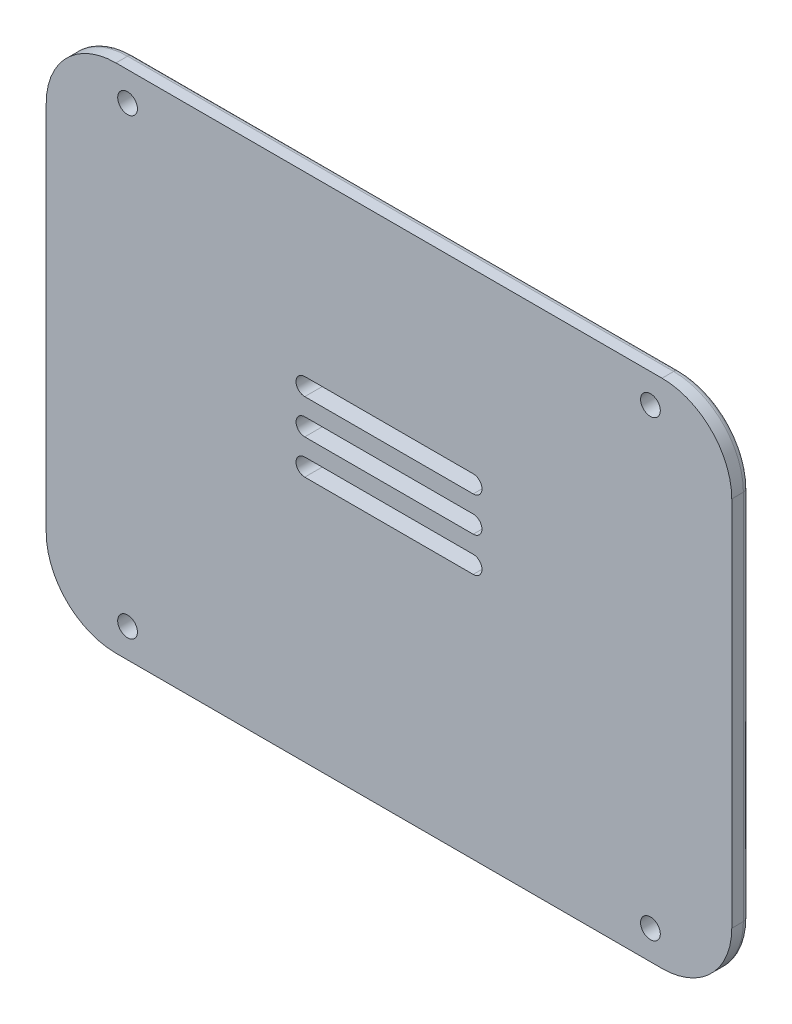
ISO-10303-21;
HEADER;
FILE_DESCRIPTION(('STEP AP214'),'2;1');
FILE_NAME('part.step','',(''),(''),'','','');
FILE_SCHEMA(('AUTOMOTIVE_DESIGN { 1 0 10303 214 1 1 1 1 }'));
ENDSEC;
DATA;
#1=APPLICATION_CONTEXT('core data for automotive mechanical design processes');
#2=APPLICATION_PROTOCOL_DEFINITION('international standard','automotive_design',2000,#1);
#3=PRODUCT_CONTEXT('',#1,'mechanical');
#4=PRODUCT('Part','Part','',(#3));
#5=PRODUCT_RELATED_PRODUCT_CATEGORY('part','',(#4));
#6=PRODUCT_DEFINITION_FORMATION('','',#4);
#7=PRODUCT_DEFINITION_CONTEXT('part definition',#1,'design');
#8=PRODUCT_DEFINITION('design','',#6,#7);
#9=PRODUCT_DEFINITION_SHAPE('','',#8);
#10=(LENGTH_UNIT() NAMED_UNIT(*) SI_UNIT(.MILLI.,.METRE.));
#11=(NAMED_UNIT(*) PLANE_ANGLE_UNIT() SI_UNIT($,.RADIAN.));
#12=(NAMED_UNIT(*) SI_UNIT($,.STERADIAN.) SOLID_ANGLE_UNIT());
#13=UNCERTAINTY_MEASURE_WITH_UNIT(LENGTH_MEASURE(1.E-05),#10,'distance_accuracy_value','');
#14=(GEOMETRIC_REPRESENTATION_CONTEXT(3) GLOBAL_UNCERTAINTY_ASSIGNED_CONTEXT((#13)) GLOBAL_UNIT_ASSIGNED_CONTEXT((#10,
#11,#12)) REPRESENTATION_CONTEXT('',''));
#15=CARTESIAN_POINT('',(0.,0.,0.));
#16=DIRECTION('',(0.,0.,1.));
#17=DIRECTION('',(1.,0.,0.));
#18=AXIS2_PLACEMENT_3D('',#15,#16,#17);
#19=CARTESIAN_POINT('',(47.,32.,3.));
#20=DIRECTION('',(0.,0.,-1.));
#21=DIRECTION('',(-1.,0.,0.));
#22=AXIS2_PLACEMENT_3D('',#19,#20,#21);
#23=CYLINDRICAL_SURFACE('',#22,12.);
#24=DIRECTION('',(0.,0.,-1.));
#25=VECTOR('',#24,1.);
#26=CARTESIAN_POINT('',(59.,31.9999999999999,3.));
#27=LINE('',#26,#25);
#28=CARTESIAN_POINT('',(59.,31.9999999999999,3.));
#29=VERTEX_POINT('',#28);
#30=CARTESIAN_POINT('',(59.,31.9999999999999,1.));
#31=VERTEX_POINT('',#30);
#32=EDGE_CURVE('E345',#29,#31,#27,.T.);
#33=ORIENTED_EDGE('',*,*,#32,.T.);
#34=CARTESIAN_POINT('',(47.,32.,1.));
#35=DIRECTION('',(0.,0.,-1.));
#36=DIRECTION('',(-1.,0.,0.));
#37=AXIS2_PLACEMENT_3D('',#34,#35,#36);
#38=CIRCLE('',#37,12.);
#39=CARTESIAN_POINT('',(46.9999999999999,44.,1.));
#40=VERTEX_POINT('',#39);
#41=EDGE_CURVE('E11',#31,#40,#38,.F.);
#42=ORIENTED_EDGE('',*,*,#41,.T.);
#43=DIRECTION('',(0.,0.,-1.));
#44=VECTOR('',#43,1.);
#45=CARTESIAN_POINT('',(46.9999999999999,44.,3.));
#46=LINE('',#45,#44);
#47=CARTESIAN_POINT('',(46.9999999999999,44.,3.));
#48=VERTEX_POINT('',#47);
#49=EDGE_CURVE('E366',#48,#40,#46,.T.);
#50=ORIENTED_EDGE('',*,*,#49,.F.);
#51=CARTESIAN_POINT('',(47.,32.,3.));
#52=DIRECTION('',(0.,0.,1.));
#53=DIRECTION('',(-1.,0.,0.));
#54=AXIS2_PLACEMENT_3D('',#51,#52,#53);
#55=CIRCLE('',#54,12.);
#56=EDGE_CURVE('E328',#29,#48,#55,.T.);
#57=ORIENTED_EDGE('',*,*,#56,.F.);
#58=EDGE_LOOP('',(#33,#42,#50,#57));
#59=FACE_BOUND('',#58,.T.);
#60=ADVANCED_FACE('F39',(#59),#23,.T.);
#61=CARTESIAN_POINT('',(-46.9999999999999,44.,3.));
#62=DIRECTION('',(0.,-1.,0.));
#63=DIRECTION('',(0.,0.,-1.));
#64=AXIS2_PLACEMENT_3D('',#61,#62,#63);
#65=PLANE('',#64);
#66=ORIENTED_EDGE('',*,*,#49,.T.);
#67=DIRECTION('',(-1.,0.,0.));
#68=VECTOR('',#67,1.);
#69=CARTESIAN_POINT('',(-46.9999999999999,44.,1.));
#70=LINE('',#69,#68);
#71=CARTESIAN_POINT('',(-46.9999999999999,44.,1.));
#72=VERTEX_POINT('',#71);
#73=EDGE_CURVE('E393',#40,#72,#70,.T.);
#74=ORIENTED_EDGE('',*,*,#73,.T.);
#75=DIRECTION('',(0.,0.,-1.));
#76=VECTOR('',#75,1.);
#77=CARTESIAN_POINT('',(-46.9999999999999,44.,3.));
#78=LINE('',#77,#76);
#79=CARTESIAN_POINT('',(-46.9999999999999,44.,3.));
#80=VERTEX_POINT('',#79);
#81=EDGE_CURVE('E363',#80,#72,#78,.T.);
#82=ORIENTED_EDGE('',*,*,#81,.F.);
#83=DIRECTION('',(-1.,0.,0.));
#84=VECTOR('',#83,1.);
#85=CARTESIAN_POINT('',(-46.9999999999999,44.,3.));
#86=LINE('',#85,#84);
#87=EDGE_CURVE('E331',#48,#80,#86,.T.);
#88=ORIENTED_EDGE('',*,*,#87,.F.);
#89=EDGE_LOOP('',(#66,#74,#82,#88));
#90=FACE_BOUND('',#89,.T.);
#91=ADVANCED_FACE('F488',(#90),#65,.F.);
#92=CARTESIAN_POINT('',(-47.,32.,3.));
#93=DIRECTION('',(0.,0.,-1.));
#94=DIRECTION('',(-1.,0.,0.));
#95=AXIS2_PLACEMENT_3D('',#92,#93,#94);
#96=CYLINDRICAL_SURFACE('',#95,12.);
#97=ORIENTED_EDGE('',*,*,#81,.T.);
#98=CARTESIAN_POINT('',(-47.,32.,1.));
#99=DIRECTION('',(0.,0.,-1.));
#100=DIRECTION('',(-1.,0.,0.));
#101=AXIS2_PLACEMENT_3D('',#98,#99,#100);
#102=CIRCLE('',#101,12.);
#103=CARTESIAN_POINT('',(-59.,31.9999999999999,1.));
#104=VERTEX_POINT('',#103);
#105=EDGE_CURVE('E395',#72,#104,#102,.F.);
#106=ORIENTED_EDGE('',*,*,#105,.T.);
#107=DIRECTION('',(0.,0.,-1.));
#108=VECTOR('',#107,1.);
#109=CARTESIAN_POINT('',(-59.,31.9999999999999,3.));
#110=LINE('',#109,#108);
#111=CARTESIAN_POINT('',(-59.,31.9999999999999,3.));
#112=VERTEX_POINT('',#111);
#113=EDGE_CURVE('E360',#112,#104,#110,.T.);
#114=ORIENTED_EDGE('',*,*,#113,.F.);
#115=CARTESIAN_POINT('',(-47.,32.,3.));
#116=DIRECTION('',(0.,0.,1.));
#117=DIRECTION('',(-1.,0.,0.));
#118=AXIS2_PLACEMENT_3D('',#115,#116,#117);
#119=CIRCLE('',#118,12.);
#120=EDGE_CURVE('E333',#80,#112,#119,.T.);
#121=ORIENTED_EDGE('',*,*,#120,.F.);
#122=EDGE_LOOP('',(#97,#106,#114,#121));
#123=FACE_BOUND('',#122,.T.);
#124=ADVANCED_FACE('F470',(#123),#96,.T.);
#125=CARTESIAN_POINT('',(-59.,-31.9999999999999,3.));
#126=DIRECTION('',(1.,0.,0.));
#127=DIRECTION('',(0.,0.,-1.));
#128=AXIS2_PLACEMENT_3D('',#125,#126,#127);
#129=PLANE('',#128);
#130=ORIENTED_EDGE('',*,*,#113,.T.);
#131=DIRECTION('',(0.,-1.,0.));
#132=VECTOR('',#131,1.);
#133=CARTESIAN_POINT('',(-59.,-31.9999999999999,1.));
#134=LINE('',#133,#132);
#135=CARTESIAN_POINT('',(-59.,-31.9999999999999,1.));
#136=VERTEX_POINT('',#135);
#137=EDGE_CURVE('E391',#104,#136,#134,.T.);
#138=ORIENTED_EDGE('',*,*,#137,.T.);
#139=DIRECTION('',(0.,0.,-1.));
#140=VECTOR('',#139,1.);
#141=CARTESIAN_POINT('',(-59.,-31.9999999999999,3.));
#142=LINE('',#141,#140);
#143=CARTESIAN_POINT('',(-59.,-31.9999999999999,3.));
#144=VERTEX_POINT('',#143);
#145=EDGE_CURVE('E357',#144,#136,#142,.T.);
#146=ORIENTED_EDGE('',*,*,#145,.F.);
#147=DIRECTION('',(0.,-1.,0.));
#148=VECTOR('',#147,1.);
#149=CARTESIAN_POINT('',(-59.,-31.9999999999999,3.));
#150=LINE('',#149,#148);
#151=EDGE_CURVE('E335',#112,#144,#150,.T.);
#152=ORIENTED_EDGE('',*,*,#151,.F.);
#153=EDGE_LOOP('',(#130,#138,#146,#152));
#154=FACE_BOUND('',#153,.T.);
#155=ADVANCED_FACE('F466',(#154),#129,.F.);
#156=CARTESIAN_POINT('',(-47.,-32.,3.));
#157=DIRECTION('',(0.,0.,-1.));
#158=DIRECTION('',(-1.,0.,0.));
#159=AXIS2_PLACEMENT_3D('',#156,#157,#158);
#160=CYLINDRICAL_SURFACE('',#159,12.);
#161=ORIENTED_EDGE('',*,*,#145,.T.);
#162=CARTESIAN_POINT('',(-47.,-32.,1.));
#163=DIRECTION('',(0.,0.,-1.));
#164=DIRECTION('',(-1.,0.,0.));
#165=AXIS2_PLACEMENT_3D('',#162,#163,#164);
#166=CIRCLE('',#165,12.);
#167=CARTESIAN_POINT('',(-46.9999999999999,-44.,1.));
#168=VERTEX_POINT('',#167);
#169=EDGE_CURVE('E397',#136,#168,#166,.F.);
#170=ORIENTED_EDGE('',*,*,#169,.T.);
#171=DIRECTION('',(0.,0.,-1.));
#172=VECTOR('',#171,1.);
#173=CARTESIAN_POINT('',(-46.9999999999999,-44.,3.));
#174=LINE('',#173,#172);
#175=CARTESIAN_POINT('',(-46.9999999999999,-44.,3.));
#176=VERTEX_POINT('',#175);
#177=EDGE_CURVE('E354',#176,#168,#174,.T.);
#178=ORIENTED_EDGE('',*,*,#177,.F.);
#179=CARTESIAN_POINT('',(-47.,-32.,3.));
#180=DIRECTION('',(0.,0.,1.));
#181=DIRECTION('',(-1.,0.,0.));
#182=AXIS2_PLACEMENT_3D('',#179,#180,#181);
#183=CIRCLE('',#182,12.);
#184=EDGE_CURVE('E337',#144,#176,#183,.T.);
#185=ORIENTED_EDGE('',*,*,#184,.F.);
#186=EDGE_LOOP('',(#161,#170,#178,#185));
#187=FACE_BOUND('',#186,.T.);
#188=ADVANCED_FACE('F462',(#187),#160,.T.);
#189=CARTESIAN_POINT('',(-46.9999999999999,-44.,3.));
#190=DIRECTION('',(0.,1.,0.));
#191=DIRECTION('',(0.,0.,1.));
#192=AXIS2_PLACEMENT_3D('',#189,#190,#191);
#193=PLANE('',#192);
#194=ORIENTED_EDGE('',*,*,#177,.T.);
#195=DIRECTION('',(1.,0.,0.));
#196=VECTOR('',#195,1.);
#197=CARTESIAN_POINT('',(46.9999999999999,-44.,1.));
#198=LINE('',#197,#196);
#199=CARTESIAN_POINT('',(46.9999999999999,-44.,1.));
#200=VERTEX_POINT('',#199);
#201=EDGE_CURVE('E389',#168,#200,#198,.T.);
#202=ORIENTED_EDGE('',*,*,#201,.T.);
#203=DIRECTION('',(0.,0.,-1.));
#204=VECTOR('',#203,1.);
#205=CARTESIAN_POINT('',(46.9999999999999,-44.,3.));
#206=LINE('',#205,#204);
#207=CARTESIAN_POINT('',(46.9999999999999,-44.,3.));
#208=VERTEX_POINT('',#207);
#209=EDGE_CURVE('E351',#208,#200,#206,.T.);
#210=ORIENTED_EDGE('',*,*,#209,.F.);
#211=DIRECTION('',(1.,0.,0.));
#212=VECTOR('',#211,1.);
#213=CARTESIAN_POINT('',(-46.9999999999999,-44.,3.));
#214=LINE('',#213,#212);
#215=EDGE_CURVE('E339',#176,#208,#214,.T.);
#216=ORIENTED_EDGE('',*,*,#215,.F.);
#217=EDGE_LOOP('',(#194,#202,#210,#216));
#218=FACE_BOUND('',#217,.T.);
#219=ADVANCED_FACE('F460',(#218),#193,.F.);
#220=CARTESIAN_POINT('',(47.,-32.,3.));
#221=DIRECTION('',(0.,0.,-1.));
#222=DIRECTION('',(-1.,0.,0.));
#223=AXIS2_PLACEMENT_3D('',#220,#221,#222);
#224=CYLINDRICAL_SURFACE('',#223,12.);
#225=ORIENTED_EDGE('',*,*,#209,.T.);
#226=CARTESIAN_POINT('',(47.,-32.,1.));
#227=DIRECTION('',(0.,0.,-1.));
#228=DIRECTION('',(-1.,0.,0.));
#229=AXIS2_PLACEMENT_3D('',#226,#227,#228);
#230=CIRCLE('',#229,12.);
#231=CARTESIAN_POINT('',(59.,-32.,1.));
#232=VERTEX_POINT('',#231);
#233=EDGE_CURVE('E48',#200,#232,#230,.F.);
#234=ORIENTED_EDGE('',*,*,#233,.T.);
#235=DIRECTION('',(0.,0.,-1.));
#236=VECTOR('',#235,1.);
#237=CARTESIAN_POINT('',(59.,-32.,3.));
#238=LINE('',#237,#236);
#239=CARTESIAN_POINT('',(59.,-32.,3.));
#240=VERTEX_POINT('',#239);
#241=EDGE_CURVE('E348',#240,#232,#238,.T.);
#242=ORIENTED_EDGE('',*,*,#241,.F.);
#243=CARTESIAN_POINT('',(47.,-32.,3.));
#244=DIRECTION('',(0.,0.,1.));
#245=DIRECTION('',(1.,0.,0.));
#246=AXIS2_PLACEMENT_3D('',#243,#244,#245);
#247=CIRCLE('',#246,12.);
#248=EDGE_CURVE('E341',#208,#240,#247,.T.);
#249=ORIENTED_EDGE('',*,*,#248,.F.);
#250=EDGE_LOOP('',(#225,#234,#242,#249));
#251=FACE_BOUND('',#250,.T.);
#252=ADVANCED_FACE('F446',(#251),#224,.T.);
#253=CARTESIAN_POINT('',(59.,-31.9999999999999,3.));
#254=DIRECTION('',(-1.,0.,0.));
#255=DIRECTION('',(0.,0.,1.));
#256=AXIS2_PLACEMENT_3D('',#253,#254,#255);
#257=PLANE('',#256);
#258=ORIENTED_EDGE('',*,*,#241,.T.);
#259=DIRECTION('',(0.,1.,0.));
#260=VECTOR('',#259,1.);
#261=CARTESIAN_POINT('',(59.,31.9999999999999,1.));
#262=LINE('',#261,#260);
#263=EDGE_CURVE('E369',#232,#31,#262,.T.);
#264=ORIENTED_EDGE('',*,*,#263,.T.);
#265=ORIENTED_EDGE('',*,*,#32,.F.);
#266=DIRECTION('',(0.,1.,0.));
#267=VECTOR('',#266,1.);
#268=CARTESIAN_POINT('',(59.,-31.9999999999999,3.));
#269=LINE('',#268,#267);
#270=EDGE_CURVE('E343',#240,#29,#269,.T.);
#271=ORIENTED_EDGE('',*,*,#270,.F.);
#272=EDGE_LOOP('',(#258,#264,#265,#271));
#273=FACE_BOUND('',#272,.T.);
#274=ADVANCED_FACE('F451',(#273),#257,.F.);
#275=CARTESIAN_POINT('',(47.,32.,3.));
#276=DIRECTION('',(0.,0.,-1.));
#277=DIRECTION('',(-1.,0.,0.));
#278=AXIS2_PLACEMENT_3D('',#275,#276,#277);
#279=PLANE('',#278);
#280=DIRECTION('',(1.,0.,0.));
#281=VECTOR('',#280,1.);
#282=CARTESIAN_POINT('',(14.5,1.5,3.));
#283=LINE('',#282,#281);
#284=CARTESIAN_POINT('',(-14.5,1.50000000000001,3.));
#285=VERTEX_POINT('',#284);
#286=CARTESIAN_POINT('',(14.5,1.5,3.));
#287=VERTEX_POINT('',#286);
#288=EDGE_CURVE('E213',#285,#287,#283,.T.);
#289=ORIENTED_EDGE('',*,*,#288,.T.);
#290=CARTESIAN_POINT('',(14.5,0.,3.));
#291=DIRECTION('',(0.,0.,-1.));
#292=DIRECTION('',(-1.,0.,0.));
#293=AXIS2_PLACEMENT_3D('',#290,#291,#292);
#294=CIRCLE('',#293,1.5);
#295=CARTESIAN_POINT('',(14.5,-1.5,3.));
#296=VERTEX_POINT('',#295);
#297=EDGE_CURVE('E205',#287,#296,#294,.T.);
#298=ORIENTED_EDGE('',*,*,#297,.T.);
#299=DIRECTION('',(-1.,0.,0.));
#300=VECTOR('',#299,1.);
#301=CARTESIAN_POINT('',(14.5,-1.5,3.));
#302=LINE('',#301,#300);
#303=CARTESIAN_POINT('',(-14.5,-1.5,3.));
#304=VERTEX_POINT('',#303);
#305=EDGE_CURVE('E216',#296,#304,#302,.T.);
#306=ORIENTED_EDGE('',*,*,#305,.T.);
#307=CARTESIAN_POINT('',(-14.5,0.,3.));
#308=DIRECTION('',(0.,0.,-1.));
#309=DIRECTION('',(-1.,0.,0.));
#310=AXIS2_PLACEMENT_3D('',#307,#308,#309);
#311=CIRCLE('',#310,1.5);
#312=EDGE_CURVE('E56',#304,#285,#311,.T.);
#313=ORIENTED_EDGE('',*,*,#312,.T.);
#314=EDGE_LOOP('',(#289,#298,#306,#313));
#315=FACE_BOUND('',#314,.T.);
#316=DIRECTION('',(1.,0.,0.));
#317=VECTOR('',#316,1.);
#318=CARTESIAN_POINT('',(14.5,7.5,3.));
#319=LINE('',#318,#317);
#320=CARTESIAN_POINT('',(-14.5,7.50000000000001,3.));
#321=VERTEX_POINT('',#320);
#322=CARTESIAN_POINT('',(14.5,7.5,3.));
#323=VERTEX_POINT('',#322);
#324=EDGE_CURVE('E246',#321,#323,#319,.T.);
#325=ORIENTED_EDGE('',*,*,#324,.T.);
#326=CARTESIAN_POINT('',(14.5,6.,3.));
#327=DIRECTION('',(0.,0.,-1.));
#328=DIRECTION('',(-1.,0.,0.));
#329=AXIS2_PLACEMENT_3D('',#326,#327,#328);
#330=CIRCLE('',#329,1.5);
#331=CARTESIAN_POINT('',(14.5,4.5,3.));
#332=VERTEX_POINT('',#331);
#333=EDGE_CURVE('E258',#323,#332,#330,.T.);
#334=ORIENTED_EDGE('',*,*,#333,.T.);
#335=DIRECTION('',(-1.,0.,0.));
#336=VECTOR('',#335,1.);
#337=CARTESIAN_POINT('',(14.5,4.5,3.));
#338=LINE('',#337,#336);
#339=CARTESIAN_POINT('',(-14.5,4.5,3.));
#340=VERTEX_POINT('',#339);
#341=EDGE_CURVE('E268',#332,#340,#338,.T.);
#342=ORIENTED_EDGE('',*,*,#341,.T.);
#343=CARTESIAN_POINT('',(-14.5,6.00000000000001,3.));
#344=DIRECTION('',(0.,0.,-1.));
#345=DIRECTION('',(-1.,0.,0.));
#346=AXIS2_PLACEMENT_3D('',#343,#344,#345);
#347=CIRCLE('',#346,1.5);
#348=EDGE_CURVE('E64',#340,#321,#347,.T.);
#349=ORIENTED_EDGE('',*,*,#348,.T.);
#350=EDGE_LOOP('',(#325,#334,#342,#349));
#351=FACE_BOUND('',#350,.T.);
#352=DIRECTION('',(1.,0.,0.));
#353=VECTOR('',#352,1.);
#354=CARTESIAN_POINT('',(14.5,13.5,3.));
#355=LINE('',#354,#353);
#356=CARTESIAN_POINT('',(-14.5,13.5,3.));
#357=VERTEX_POINT('',#356);
#358=CARTESIAN_POINT('',(14.5,13.5,3.));
#359=VERTEX_POINT('',#358);
#360=EDGE_CURVE('E276',#357,#359,#355,.T.);
#361=ORIENTED_EDGE('',*,*,#360,.T.);
#362=CARTESIAN_POINT('',(14.5,12.,3.));
#363=DIRECTION('',(0.,0.,-1.));
#364=DIRECTION('',(-1.,0.,0.));
#365=AXIS2_PLACEMENT_3D('',#362,#363,#364);
#366=CIRCLE('',#365,1.5);
#367=CARTESIAN_POINT('',(14.5,10.5,3.));
#368=VERTEX_POINT('',#367);
#369=EDGE_CURVE('E287',#359,#368,#366,.T.);
#370=ORIENTED_EDGE('',*,*,#369,.T.);
#371=DIRECTION('',(-1.,0.,0.));
#372=VECTOR('',#371,1.);
#373=CARTESIAN_POINT('',(14.5,10.5,3.));
#374=LINE('',#373,#372);
#375=CARTESIAN_POINT('',(-14.5,10.5,3.));
#376=VERTEX_POINT('',#375);
#377=EDGE_CURVE('E299',#368,#376,#374,.T.);
#378=ORIENTED_EDGE('',*,*,#377,.T.);
#379=CARTESIAN_POINT('',(-14.5,12.,3.));
#380=DIRECTION('',(0.,0.,-1.));
#381=DIRECTION('',(-1.,0.,0.));
#382=AXIS2_PLACEMENT_3D('',#379,#380,#381);
#383=CIRCLE('',#382,1.5);
#384=EDGE_CURVE('E296',#376,#357,#383,.T.);
#385=ORIENTED_EDGE('',*,*,#384,.T.);
#386=EDGE_LOOP('',(#361,#370,#378,#385));
#387=FACE_BOUND('',#386,.T.);
#388=CARTESIAN_POINT('',(-45.,39.,3.));
#389=DIRECTION('',(0.,0.,-1.));
#390=DIRECTION('',(-1.,0.,0.));
#391=AXIS2_PLACEMENT_3D('',#388,#389,#390);
#392=CIRCLE('',#391,1.7);
#393=CARTESIAN_POINT('',(-46.7,39.,3.));
#394=VERTEX_POINT('',#393);
#395=EDGE_CURVE('E314',#394,#394,#392,.T.);
#396=ORIENTED_EDGE('',*,*,#395,.T.);
#397=EDGE_LOOP('',(#396));
#398=FACE_BOUND('',#397,.T.);
#399=CARTESIAN_POINT('',(45.,-39.,3.));
#400=DIRECTION('',(0.,0.,-1.));
#401=DIRECTION('',(-1.,0.,0.));
#402=AXIS2_PLACEMENT_3D('',#399,#400,#401);
#403=CIRCLE('',#402,1.7);
#404=CARTESIAN_POINT('',(43.3,-39.,3.));
#405=VERTEX_POINT('',#404);
#406=EDGE_CURVE('E307',#405,#405,#403,.T.);
#407=ORIENTED_EDGE('',*,*,#406,.T.);
#408=EDGE_LOOP('',(#407));
#409=FACE_BOUND('',#408,.T.);
#410=CARTESIAN_POINT('',(-45.,-39.,3.));
#411=DIRECTION('',(0.,0.,-1.));
#412=DIRECTION('',(-1.,0.,0.));
#413=AXIS2_PLACEMENT_3D('',#410,#411,#412);
#414=CIRCLE('',#413,1.7);
#415=CARTESIAN_POINT('',(-46.7,-39.,3.));
#416=VERTEX_POINT('',#415);
#417=EDGE_CURVE('E239',#416,#416,#414,.T.);
#418=ORIENTED_EDGE('',*,*,#417,.T.);
#419=EDGE_LOOP('',(#418));
#420=FACE_BOUND('',#419,.T.);
#421=CARTESIAN_POINT('',(45.,39.,3.));
#422=DIRECTION('',(0.,0.,-1.));
#423=DIRECTION('',(-1.,0.,0.));
#424=AXIS2_PLACEMENT_3D('',#421,#422,#423);
#425=CIRCLE('',#424,1.7);
#426=CARTESIAN_POINT('',(43.3,39.,3.));
#427=VERTEX_POINT('',#426);
#428=EDGE_CURVE('E322',#427,#427,#425,.T.);
#429=ORIENTED_EDGE('',*,*,#428,.T.);
#430=EDGE_LOOP('',(#429));
#431=FACE_BOUND('',#430,.T.);
#432=ORIENTED_EDGE('',*,*,#56,.T.);
#433=ORIENTED_EDGE('',*,*,#87,.T.);
#434=ORIENTED_EDGE('',*,*,#120,.T.);
#435=ORIENTED_EDGE('',*,*,#151,.T.);
#436=ORIENTED_EDGE('',*,*,#184,.T.);
#437=ORIENTED_EDGE('',*,*,#215,.T.);
#438=ORIENTED_EDGE('',*,*,#248,.T.);
#439=ORIENTED_EDGE('',*,*,#270,.T.);
#440=EDGE_LOOP('',(#432,#433,#434,#435,#436,#437,#438,#439));
#441=FACE_BOUND('',#440,.T.);
#442=ADVANCED_FACE('F220',(#315,#351,#387,#398,#409,#420,#431,#441),#279,.F.);
#443=CARTESIAN_POINT('',(47.,32.,0.));
#444=DIRECTION('',(0.,0.,-1.));
#445=DIRECTION('',(-1.,0.,0.));
#446=AXIS2_PLACEMENT_3D('',#443,#444,#445);
#447=PLANE('',#446);
#448=CARTESIAN_POINT('',(14.5,0.,0.));
#449=DIRECTION('',(0.,0.,-1.));
#450=DIRECTION('',(-1.,0.,0.));
#451=AXIS2_PLACEMENT_3D('',#448,#449,#450);
#452=CIRCLE('',#451,1.5);
#453=CARTESIAN_POINT('',(14.5,1.5,0.));
#454=VERTEX_POINT('',#453);
#455=CARTESIAN_POINT('',(14.5,-1.5,0.));
#456=VERTEX_POINT('',#455);
#457=EDGE_CURVE('E208',#454,#456,#452,.T.);
#458=ORIENTED_EDGE('',*,*,#457,.F.);
#459=DIRECTION('',(1.,0.,0.));
#460=VECTOR('',#459,1.);
#461=CARTESIAN_POINT('',(14.5,1.5,0.));
#462=LINE('',#461,#460);
#463=CARTESIAN_POINT('',(-14.5,1.50000000000001,0.));
#464=VERTEX_POINT('',#463);
#465=EDGE_CURVE('E223',#464,#454,#462,.T.);
#466=ORIENTED_EDGE('',*,*,#465,.F.);
#467=CARTESIAN_POINT('',(-14.5,0.,0.));
#468=DIRECTION('',(0.,0.,-1.));
#469=DIRECTION('',(-1.,0.,0.));
#470=AXIS2_PLACEMENT_3D('',#467,#468,#469);
#471=CIRCLE('',#470,1.5);
#472=CARTESIAN_POINT('',(-14.5,-1.49999999999999,0.));
#473=VERTEX_POINT('',#472);
#474=EDGE_CURVE('E226',#473,#464,#471,.T.);
#475=ORIENTED_EDGE('',*,*,#474,.F.);
#476=DIRECTION('',(-1.,0.,0.));
#477=VECTOR('',#476,1.);
#478=CARTESIAN_POINT('',(14.5,-1.5,0.));
#479=LINE('',#478,#477);
#480=EDGE_CURVE('E232',#456,#473,#479,.T.);
#481=ORIENTED_EDGE('',*,*,#480,.F.);
#482=EDGE_LOOP('',(#458,#466,#475,#481));
#483=FACE_BOUND('',#482,.T.);
#484=CARTESIAN_POINT('',(14.5,6.,0.));
#485=DIRECTION('',(0.,0.,-1.));
#486=DIRECTION('',(-1.,0.,0.));
#487=AXIS2_PLACEMENT_3D('',#484,#485,#486);
#488=CIRCLE('',#487,1.5);
#489=CARTESIAN_POINT('',(14.5,7.5,0.));
#490=VERTEX_POINT('',#489);
#491=CARTESIAN_POINT('',(14.5,4.5,0.));
#492=VERTEX_POINT('',#491);
#493=EDGE_CURVE('E233',#490,#492,#488,.T.);
#494=ORIENTED_EDGE('',*,*,#493,.F.);
#495=DIRECTION('',(1.,0.,0.));
#496=VECTOR('',#495,1.);
#497=CARTESIAN_POINT('',(14.5,7.5,0.));
#498=LINE('',#497,#496);
#499=CARTESIAN_POINT('',(-14.5,7.50000000000001,0.));
#500=VERTEX_POINT('',#499);
#501=EDGE_CURVE('E254',#500,#490,#498,.T.);
#502=ORIENTED_EDGE('',*,*,#501,.F.);
#503=CARTESIAN_POINT('',(-14.5,6.00000000000001,0.));
#504=DIRECTION('',(0.,0.,-1.));
#505=DIRECTION('',(-1.,0.,0.));
#506=AXIS2_PLACEMENT_3D('',#503,#504,#505);
#507=CIRCLE('',#506,1.5);
#508=CARTESIAN_POINT('',(-14.5,4.50000000000001,0.));
#509=VERTEX_POINT('',#508);
#510=EDGE_CURVE('E257',#509,#500,#507,.T.);
#511=ORIENTED_EDGE('',*,*,#510,.F.);
#512=DIRECTION('',(-1.,0.,0.));
#513=VECTOR('',#512,1.);
#514=CARTESIAN_POINT('',(14.5,4.5,0.));
#515=LINE('',#514,#513);
#516=EDGE_CURVE('E261',#492,#509,#515,.T.);
#517=ORIENTED_EDGE('',*,*,#516,.F.);
#518=EDGE_LOOP('',(#494,#502,#511,#517));
#519=FACE_BOUND('',#518,.T.);
#520=CARTESIAN_POINT('',(14.5,12.,0.));
#521=DIRECTION('',(0.,0.,-1.));
#522=DIRECTION('',(-1.,0.,0.));
#523=AXIS2_PLACEMENT_3D('',#520,#521,#522);
#524=CIRCLE('',#523,1.5);
#525=CARTESIAN_POINT('',(14.5,13.5,0.));
#526=VERTEX_POINT('',#525);
#527=CARTESIAN_POINT('',(14.5,10.5,0.));
#528=VERTEX_POINT('',#527);
#529=EDGE_CURVE('E253',#526,#528,#524,.T.);
#530=ORIENTED_EDGE('',*,*,#529,.F.);
#531=DIRECTION('',(1.,0.,0.));
#532=VECTOR('',#531,1.);
#533=CARTESIAN_POINT('',(14.5,13.5,0.));
#534=LINE('',#533,#532);
#535=CARTESIAN_POINT('',(-14.5,13.5,0.));
#536=VERTEX_POINT('',#535);
#537=EDGE_CURVE('E283',#536,#526,#534,.T.);
#538=ORIENTED_EDGE('',*,*,#537,.F.);
#539=CARTESIAN_POINT('',(-14.5,12.,0.));
#540=DIRECTION('',(0.,0.,-1.));
#541=DIRECTION('',(-1.,0.,0.));
#542=AXIS2_PLACEMENT_3D('',#539,#540,#541);
#543=CIRCLE('',#542,1.5);
#544=CARTESIAN_POINT('',(-14.5,10.5,0.));
#545=VERTEX_POINT('',#544);
#546=EDGE_CURVE('E286',#545,#536,#543,.T.);
#547=ORIENTED_EDGE('',*,*,#546,.F.);
#548=DIRECTION('',(-1.,0.,0.));
#549=VECTOR('',#548,1.);
#550=CARTESIAN_POINT('',(14.5,10.5,0.));
#551=LINE('',#550,#549);
#552=EDGE_CURVE('E290',#528,#545,#551,.T.);
#553=ORIENTED_EDGE('',*,*,#552,.F.);
#554=EDGE_LOOP('',(#530,#538,#547,#553));
#555=FACE_BOUND('',#554,.T.);
#556=CARTESIAN_POINT('',(-45.,39.,0.));
#557=DIRECTION('',(0.,0.,-1.));
#558=DIRECTION('',(-1.,0.,0.));
#559=AXIS2_PLACEMENT_3D('',#556,#557,#558);
#560=CIRCLE('',#559,1.7);
#561=CARTESIAN_POINT('',(-46.7,39.,0.));
#562=VERTEX_POINT('',#561);
#563=EDGE_CURVE('E310',#562,#562,#560,.T.);
#564=ORIENTED_EDGE('',*,*,#563,.F.);
#565=EDGE_LOOP('',(#564));
#566=FACE_BOUND('',#565,.T.);
#567=CARTESIAN_POINT('',(45.,-39.,0.));
#568=DIRECTION('',(0.,0.,-1.));
#569=DIRECTION('',(-1.,0.,0.));
#570=AXIS2_PLACEMENT_3D('',#567,#568,#569);
#571=CIRCLE('',#570,1.7);
#572=CARTESIAN_POINT('',(43.3,-39.,0.));
#573=VERTEX_POINT('',#572);
#574=EDGE_CURVE('E317',#573,#573,#571,.T.);
#575=ORIENTED_EDGE('',*,*,#574,.F.);
#576=EDGE_LOOP('',(#575));
#577=FACE_BOUND('',#576,.T.);
#578=CARTESIAN_POINT('',(-45.,-39.,0.));
#579=DIRECTION('',(0.,0.,-1.));
#580=DIRECTION('',(-1.,0.,0.));
#581=AXIS2_PLACEMENT_3D('',#578,#579,#580);
#582=CIRCLE('',#581,1.7);
#583=CARTESIAN_POINT('',(-46.7,-39.,0.));
#584=VERTEX_POINT('',#583);
#585=EDGE_CURVE('E304',#584,#584,#582,.T.);
#586=ORIENTED_EDGE('',*,*,#585,.F.);
#587=EDGE_LOOP('',(#586));
#588=FACE_BOUND('',#587,.T.);
#589=CARTESIAN_POINT('',(45.,39.,0.));
#590=DIRECTION('',(0.,0.,-1.));
#591=DIRECTION('',(-1.,0.,0.));
#592=AXIS2_PLACEMENT_3D('',#589,#590,#591);
#593=CIRCLE('',#592,1.7);
#594=CARTESIAN_POINT('',(43.3,39.,0.));
#595=VERTEX_POINT('',#594);
#596=EDGE_CURVE('E313',#595,#595,#593,.T.);
#597=ORIENTED_EDGE('',*,*,#596,.F.);
#598=EDGE_LOOP('',(#597));
#599=FACE_BOUND('',#598,.T.);
#600=DIRECTION('',(1.,0.,0.));
#601=VECTOR('',#600,1.);
#602=CARTESIAN_POINT('',(-46.9999999999999,-43.,0.));
#603=LINE('',#602,#601);
#604=CARTESIAN_POINT('',(46.9999999999999,-43.,0.));
#605=VERTEX_POINT('',#604);
#606=CARTESIAN_POINT('',(-46.9999999999999,-43.,0.));
#607=VERTEX_POINT('',#606);
#608=EDGE_CURVE('E385',#605,#607,#603,.F.);
#609=ORIENTED_EDGE('',*,*,#608,.T.);
#610=CARTESIAN_POINT('',(-47.,-32.,0.));
#611=DIRECTION('',(0.,0.,-1.));
#612=DIRECTION('',(-1.,0.,0.));
#613=AXIS2_PLACEMENT_3D('',#610,#611,#612);
#614=CIRCLE('',#613,11.);
#615=CARTESIAN_POINT('',(-58.,-31.9999999999999,0.));
#616=VERTEX_POINT('',#615);
#617=EDGE_CURVE('E387',#607,#616,#614,.T.);
#618=ORIENTED_EDGE('',*,*,#617,.T.);
#619=DIRECTION('',(0.,-1.,0.));
#620=VECTOR('',#619,1.);
#621=CARTESIAN_POINT('',(-58.,31.9999999999999,0.));
#622=LINE('',#621,#620);
#623=CARTESIAN_POINT('',(-58.,31.9999999999999,0.));
#624=VERTEX_POINT('',#623);
#625=EDGE_CURVE('E383',#616,#624,#622,.F.);
#626=ORIENTED_EDGE('',*,*,#625,.T.);
#627=CARTESIAN_POINT('',(-47.,32.,0.));
#628=DIRECTION('',(0.,0.,-1.));
#629=DIRECTION('',(-1.,0.,0.));
#630=AXIS2_PLACEMENT_3D('',#627,#628,#629);
#631=CIRCLE('',#630,11.);
#632=CARTESIAN_POINT('',(-46.9999999999999,43.,0.));
#633=VERTEX_POINT('',#632);
#634=EDGE_CURVE('E381',#624,#633,#631,.T.);
#635=ORIENTED_EDGE('',*,*,#634,.T.);
#636=DIRECTION('',(-1.,0.,0.));
#637=VECTOR('',#636,1.);
#638=CARTESIAN_POINT('',(46.9999999999999,43.,0.));
#639=LINE('',#638,#637);
#640=CARTESIAN_POINT('',(46.9999999999999,43.,0.));
#641=VERTEX_POINT('',#640);
#642=EDGE_CURVE('E374',#633,#641,#639,.F.);
#643=ORIENTED_EDGE('',*,*,#642,.T.);
#644=CARTESIAN_POINT('',(47.,32.,0.));
#645=DIRECTION('',(0.,0.,-1.));
#646=DIRECTION('',(-1.,0.,0.));
#647=AXIS2_PLACEMENT_3D('',#644,#645,#646);
#648=CIRCLE('',#647,11.);
#649=CARTESIAN_POINT('',(58.,31.9999999999999,0.));
#650=VERTEX_POINT('',#649);
#651=EDGE_CURVE('E372',#641,#650,#648,.T.);
#652=ORIENTED_EDGE('',*,*,#651,.T.);
#653=DIRECTION('',(0.,1.,0.));
#654=VECTOR('',#653,1.);
#655=CARTESIAN_POINT('',(58.,-32.,0.));
#656=LINE('',#655,#654);
#657=CARTESIAN_POINT('',(58.,-32.,0.));
#658=VERTEX_POINT('',#657);
#659=EDGE_CURVE('E376',#650,#658,#656,.F.);
#660=ORIENTED_EDGE('',*,*,#659,.T.);
#661=CARTESIAN_POINT('',(47.,-32.,0.));
#662=DIRECTION('',(0.,0.,-1.));
#663=DIRECTION('',(-1.,0.,0.));
#664=AXIS2_PLACEMENT_3D('',#661,#662,#663);
#665=CIRCLE('',#664,11.);
#666=EDGE_CURVE('E379',#658,#605,#665,.T.);
#667=ORIENTED_EDGE('',*,*,#666,.T.);
#668=EDGE_LOOP('',(#609,#618,#626,#635,#643,#652,#660,#667));
#669=FACE_BOUND('',#668,.T.);
#670=ADVANCED_FACE('F431',(#483,#519,#555,#566,#577,#588,#599,#669),#447,.T.);
#671=CARTESIAN_POINT('',(-58.,-31.9999999999999,1.));
#672=DIRECTION('',(0.,1.,0.));
#673=DIRECTION('',(0.,0.,1.));
#674=AXIS2_PLACEMENT_3D('',#671,#672,#673);
#675=CYLINDRICAL_SURFACE('',#674,1.);
#676=CARTESIAN_POINT('',(-58.,31.9999999999999,1.));
#677=DIRECTION('',(0.,1.,0.));
#678=DIRECTION('',(0.,0.,1.));
#679=AXIS2_PLACEMENT_3D('',#676,#677,#678);
#680=CIRCLE('',#679,1.);
#681=EDGE_CURVE('E414',#624,#104,#680,.T.);
#682=ORIENTED_EDGE('',*,*,#681,.F.);
#683=ORIENTED_EDGE('',*,*,#625,.F.);
#684=CARTESIAN_POINT('',(-58.,-31.9999999999999,1.));
#685=DIRECTION('',(0.,-1.,0.));
#686=DIRECTION('',(0.,0.,-1.));
#687=AXIS2_PLACEMENT_3D('',#684,#685,#686);
#688=CIRCLE('',#687,1.);
#689=EDGE_CURVE('E43',#136,#616,#688,.T.);
#690=ORIENTED_EDGE('',*,*,#689,.F.);
#691=ORIENTED_EDGE('',*,*,#137,.F.);
#692=EDGE_LOOP('',(#682,#683,#690,#691));
#693=FACE_BOUND('',#692,.T.);
#694=ADVANCED_FACE('F41',(#693),#675,.T.);
#695=CARTESIAN_POINT('',(-47.,-32.,1.));
#696=DIRECTION('',(0.,0.,-1.));
#697=DIRECTION('',(-1.,0.,0.));
#698=AXIS2_PLACEMENT_3D('',#695,#696,#697);
#699=TOROIDAL_SURFACE('',#698,11.,1.);
#700=ORIENTED_EDGE('',*,*,#689,.T.);
#701=ORIENTED_EDGE('',*,*,#617,.F.);
#702=CARTESIAN_POINT('',(-46.9999999999999,-43.,1.));
#703=DIRECTION('',(1.,0.,0.));
#704=DIRECTION('',(0.,0.,-1.));
#705=AXIS2_PLACEMENT_3D('',#702,#703,#704);
#706=CIRCLE('',#705,1.);
#707=EDGE_CURVE('E412',#168,#607,#706,.T.);
#708=ORIENTED_EDGE('',*,*,#707,.F.);
#709=ORIENTED_EDGE('',*,*,#169,.F.);
#710=EDGE_LOOP('',(#700,#701,#708,#709));
#711=FACE_BOUND('',#710,.T.);
#712=ADVANCED_FACE('F425',(#711),#699,.T.);
#713=CARTESIAN_POINT('',(-47.,32.,1.));
#714=DIRECTION('',(0.,0.,-1.));
#715=DIRECTION('',(-1.,0.,0.));
#716=AXIS2_PLACEMENT_3D('',#713,#714,#715);
#717=TOROIDAL_SURFACE('',#716,11.,1.);
#718=ORIENTED_EDGE('',*,*,#681,.T.);
#719=ORIENTED_EDGE('',*,*,#105,.F.);
#720=CARTESIAN_POINT('',(-46.9999999999999,43.,1.));
#721=DIRECTION('',(1.,0.,0.));
#722=DIRECTION('',(0.,0.,-1.));
#723=AXIS2_PLACEMENT_3D('',#720,#721,#722);
#724=CIRCLE('',#723,1.);
#725=EDGE_CURVE('E409',#633,#72,#724,.T.);
#726=ORIENTED_EDGE('',*,*,#725,.F.);
#727=ORIENTED_EDGE('',*,*,#634,.F.);
#728=EDGE_LOOP('',(#718,#719,#726,#727));
#729=FACE_BOUND('',#728,.T.);
#730=ADVANCED_FACE('F472',(#729),#717,.T.);
#731=CARTESIAN_POINT('',(-46.9999999999999,-43.,1.));
#732=DIRECTION('',(-1.,0.,0.));
#733=DIRECTION('',(0.,0.,1.));
#734=AXIS2_PLACEMENT_3D('',#731,#732,#733);
#735=CYLINDRICAL_SURFACE('',#734,1.);
#736=ORIENTED_EDGE('',*,*,#707,.T.);
#737=ORIENTED_EDGE('',*,*,#608,.F.);
#738=CARTESIAN_POINT('',(46.9999999999999,-43.,1.));
#739=DIRECTION('',(1.,0.,0.));
#740=DIRECTION('',(0.,0.,-1.));
#741=AXIS2_PLACEMENT_3D('',#738,#739,#740);
#742=CIRCLE('',#741,1.);
#743=EDGE_CURVE('E406',#200,#605,#742,.T.);
#744=ORIENTED_EDGE('',*,*,#743,.F.);
#745=ORIENTED_EDGE('',*,*,#201,.F.);
#746=EDGE_LOOP('',(#736,#737,#744,#745));
#747=FACE_BOUND('',#746,.T.);
#748=ADVANCED_FACE('F437',(#747),#735,.T.);
#749=CARTESIAN_POINT('',(-46.9999999999999,43.,1.));
#750=DIRECTION('',(1.,0.,0.));
#751=DIRECTION('',(0.,0.,-1.));
#752=AXIS2_PLACEMENT_3D('',#749,#750,#751);
#753=CYLINDRICAL_SURFACE('',#752,1.);
#754=ORIENTED_EDGE('',*,*,#725,.T.);
#755=ORIENTED_EDGE('',*,*,#73,.F.);
#756=CARTESIAN_POINT('',(46.9999999999999,43.,1.));
#757=DIRECTION('',(1.,0.,0.));
#758=DIRECTION('',(0.,0.,-1.));
#759=AXIS2_PLACEMENT_3D('',#756,#757,#758);
#760=CIRCLE('',#759,1.);
#761=EDGE_CURVE('E403',#641,#40,#760,.T.);
#762=ORIENTED_EDGE('',*,*,#761,.F.);
#763=ORIENTED_EDGE('',*,*,#642,.F.);
#764=EDGE_LOOP('',(#754,#755,#762,#763));
#765=FACE_BOUND('',#764,.T.);
#766=ADVANCED_FACE('F476',(#765),#753,.T.);
#767=CARTESIAN_POINT('',(47.,-32.,1.));
#768=DIRECTION('',(0.,0.,-1.));
#769=DIRECTION('',(-1.,0.,0.));
#770=AXIS2_PLACEMENT_3D('',#767,#768,#769);
#771=TOROIDAL_SURFACE('',#770,11.,1.);
#772=ORIENTED_EDGE('',*,*,#743,.T.);
#773=ORIENTED_EDGE('',*,*,#666,.F.);
#774=CARTESIAN_POINT('',(58.,-32.,1.));
#775=DIRECTION('',(0.,1.,0.));
#776=DIRECTION('',(0.,0.,1.));
#777=AXIS2_PLACEMENT_3D('',#774,#775,#776);
#778=CIRCLE('',#777,1.);
#779=EDGE_CURVE('E401',#232,#658,#778,.T.);
#780=ORIENTED_EDGE('',*,*,#779,.F.);
#781=ORIENTED_EDGE('',*,*,#233,.F.);
#782=EDGE_LOOP('',(#772,#773,#780,#781));
#783=FACE_BOUND('',#782,.T.);
#784=ADVANCED_FACE('F441',(#783),#771,.T.);
#785=CARTESIAN_POINT('',(47.,32.,1.));
#786=DIRECTION('',(0.,0.,-1.));
#787=DIRECTION('',(-1.,0.,0.));
#788=AXIS2_PLACEMENT_3D('',#785,#786,#787);
#789=TOROIDAL_SURFACE('',#788,11.,1.);
#790=ORIENTED_EDGE('',*,*,#761,.T.);
#791=ORIENTED_EDGE('',*,*,#41,.F.);
#792=CARTESIAN_POINT('',(58.,31.9999999999999,1.));
#793=DIRECTION('',(0.,-1.,0.));
#794=DIRECTION('',(0.,0.,-1.));
#795=AXIS2_PLACEMENT_3D('',#792,#793,#794);
#796=CIRCLE('',#795,1.);
#797=EDGE_CURVE('E325',#650,#31,#796,.T.);
#798=ORIENTED_EDGE('',*,*,#797,.F.);
#799=ORIENTED_EDGE('',*,*,#651,.F.);
#800=EDGE_LOOP('',(#790,#791,#798,#799));
#801=FACE_BOUND('',#800,.T.);
#802=ADVANCED_FACE('F485',(#801),#789,.T.);
#803=CARTESIAN_POINT('',(58.,-31.9999999999999,1.));
#804=DIRECTION('',(0.,-1.,0.));
#805=DIRECTION('',(0.,0.,-1.));
#806=AXIS2_PLACEMENT_3D('',#803,#804,#805);
#807=CYLINDRICAL_SURFACE('',#806,1.);
#808=ORIENTED_EDGE('',*,*,#779,.T.);
#809=ORIENTED_EDGE('',*,*,#659,.F.);
#810=ORIENTED_EDGE('',*,*,#797,.T.);
#811=ORIENTED_EDGE('',*,*,#263,.F.);
#812=EDGE_LOOP('',(#808,#809,#810,#811));
#813=FACE_BOUND('',#812,.T.);
#814=ADVANCED_FACE('F483',(#813),#807,.T.);
#815=CARTESIAN_POINT('',(45.,39.,3.));
#816=DIRECTION('',(0.,0.,-1.));
#817=DIRECTION('',(-1.,0.,0.));
#818=AXIS2_PLACEMENT_3D('',#815,#816,#817);
#819=CYLINDRICAL_SURFACE('',#818,1.7);
#820=ORIENTED_EDGE('',*,*,#428,.F.);
#821=EDGE_LOOP('',(#820));
#822=FACE_BOUND('',#821,.T.);
#823=ORIENTED_EDGE('',*,*,#596,.T.);
#824=EDGE_LOOP('',(#823));
#825=FACE_BOUND('',#824,.T.);
#826=ADVANCED_FACE('F501',(#822,#825),#819,.F.);
#827=CARTESIAN_POINT('',(-45.,-39.,3.));
#828=DIRECTION('',(0.,0.,-1.));
#829=DIRECTION('',(-1.,0.,0.));
#830=AXIS2_PLACEMENT_3D('',#827,#828,#829);
#831=CYLINDRICAL_SURFACE('',#830,1.7);
#832=ORIENTED_EDGE('',*,*,#417,.F.);
#833=EDGE_LOOP('',(#832));
#834=FACE_BOUND('',#833,.T.);
#835=ORIENTED_EDGE('',*,*,#585,.T.);
#836=EDGE_LOOP('',(#835));
#837=FACE_BOUND('',#836,.T.);
#838=ADVANCED_FACE('F625',(#834,#837),#831,.F.);
#839=CARTESIAN_POINT('',(45.,-39.,3.));
#840=DIRECTION('',(0.,0.,-1.));
#841=DIRECTION('',(-1.,0.,0.));
#842=AXIS2_PLACEMENT_3D('',#839,#840,#841);
#843=CYLINDRICAL_SURFACE('',#842,1.7);
#844=ORIENTED_EDGE('',*,*,#406,.F.);
#845=EDGE_LOOP('',(#844));
#846=FACE_BOUND('',#845,.T.);
#847=ORIENTED_EDGE('',*,*,#574,.T.);
#848=EDGE_LOOP('',(#847));
#849=FACE_BOUND('',#848,.T.);
#850=ADVANCED_FACE('F634',(#846,#849),#843,.F.);
#851=CARTESIAN_POINT('',(-45.,39.,3.));
#852=DIRECTION('',(0.,0.,-1.));
#853=DIRECTION('',(-1.,0.,0.));
#854=AXIS2_PLACEMENT_3D('',#851,#852,#853);
#855=CYLINDRICAL_SURFACE('',#854,1.7);
#856=ORIENTED_EDGE('',*,*,#395,.F.);
#857=EDGE_LOOP('',(#856));
#858=FACE_BOUND('',#857,.T.);
#859=ORIENTED_EDGE('',*,*,#563,.T.);
#860=EDGE_LOOP('',(#859));
#861=FACE_BOUND('',#860,.T.);
#862=ADVANCED_FACE('F644',(#858,#861),#855,.F.);
#863=CARTESIAN_POINT('',(14.5,12.,3.));
#864=DIRECTION('',(0.,0.,-1.));
#865=DIRECTION('',(-1.,0.,0.));
#866=AXIS2_PLACEMENT_3D('',#863,#864,#865);
#867=CYLINDRICAL_SURFACE('',#866,1.5);
#868=ORIENTED_EDGE('',*,*,#529,.T.);
#869=DIRECTION('',(0.,0.,-1.));
#870=VECTOR('',#869,1.);
#871=CARTESIAN_POINT('',(14.5,10.5,3.));
#872=LINE('',#871,#870);
#873=EDGE_CURVE('E273',#368,#528,#872,.T.);
#874=ORIENTED_EDGE('',*,*,#873,.F.);
#875=ORIENTED_EDGE('',*,*,#369,.F.);
#876=DIRECTION('',(0.,0.,-1.));
#877=VECTOR('',#876,1.);
#878=CARTESIAN_POINT('',(14.5,13.5,3.));
#879=LINE('',#878,#877);
#880=EDGE_CURVE('E281',#359,#526,#879,.T.);
#881=ORIENTED_EDGE('',*,*,#880,.T.);
#882=EDGE_LOOP('',(#868,#874,#875,#881));
#883=FACE_BOUND('',#882,.T.);
#884=ADVANCED_FACE('F653',(#883),#867,.F.);
#885=CARTESIAN_POINT('',(14.5,13.5,3.));
#886=DIRECTION('',(0.,1.,0.));
#887=DIRECTION('',(-1.,0.,0.));
#888=AXIS2_PLACEMENT_3D('',#885,#886,#887);
#889=PLANE('',#888);
#890=ORIENTED_EDGE('',*,*,#537,.T.);
#891=ORIENTED_EDGE('',*,*,#880,.F.);
#892=ORIENTED_EDGE('',*,*,#360,.F.);
#893=DIRECTION('',(0.,0.,-1.));
#894=VECTOR('',#893,1.);
#895=CARTESIAN_POINT('',(-14.5,13.5,3.));
#896=LINE('',#895,#894);
#897=EDGE_CURVE('E279',#357,#536,#896,.T.);
#898=ORIENTED_EDGE('',*,*,#897,.T.);
#899=EDGE_LOOP('',(#890,#891,#892,#898));
#900=FACE_BOUND('',#899,.T.);
#901=ADVANCED_FACE('F662',(#900),#889,.F.);
#902=CARTESIAN_POINT('',(-14.5,12.,3.));
#903=DIRECTION('',(0.,0.,-1.));
#904=DIRECTION('',(-1.,0.,0.));
#905=AXIS2_PLACEMENT_3D('',#902,#903,#904);
#906=CYLINDRICAL_SURFACE('',#905,1.5);
#907=ORIENTED_EDGE('',*,*,#546,.T.);
#908=ORIENTED_EDGE('',*,*,#897,.F.);
#909=ORIENTED_EDGE('',*,*,#384,.F.);
#910=DIRECTION('',(0.,0.,-1.));
#911=VECTOR('',#910,1.);
#912=CARTESIAN_POINT('',(-14.5,10.5,3.));
#913=LINE('',#912,#911);
#914=EDGE_CURVE('E277',#376,#545,#913,.T.);
#915=ORIENTED_EDGE('',*,*,#914,.T.);
#916=EDGE_LOOP('',(#907,#908,#909,#915));
#917=FACE_BOUND('',#916,.T.);
#918=ADVANCED_FACE('F672',(#917),#906,.F.);
#919=CARTESIAN_POINT('',(14.5,10.5,3.));
#920=DIRECTION('',(0.,-1.,0.));
#921=DIRECTION('',(1.,0.,0.));
#922=AXIS2_PLACEMENT_3D('',#919,#920,#921);
#923=PLANE('',#922);
#924=ORIENTED_EDGE('',*,*,#552,.T.);
#925=ORIENTED_EDGE('',*,*,#914,.F.);
#926=ORIENTED_EDGE('',*,*,#377,.F.);
#927=ORIENTED_EDGE('',*,*,#873,.T.);
#928=EDGE_LOOP('',(#924,#925,#926,#927));
#929=FACE_BOUND('',#928,.T.);
#930=ADVANCED_FACE('F682',(#929),#923,.F.);
#931=CARTESIAN_POINT('',(14.5,6.,3.));
#932=DIRECTION('',(0.,0.,-1.));
#933=DIRECTION('',(-1.,0.,0.));
#934=AXIS2_PLACEMENT_3D('',#931,#932,#933);
#935=CYLINDRICAL_SURFACE('',#934,1.5);
#936=ORIENTED_EDGE('',*,*,#493,.T.);
#937=DIRECTION('',(0.,0.,-1.));
#938=VECTOR('',#937,1.);
#939=CARTESIAN_POINT('',(14.5,4.5,3.));
#940=LINE('',#939,#938);
#941=EDGE_CURVE('E243',#332,#492,#940,.T.);
#942=ORIENTED_EDGE('',*,*,#941,.F.);
#943=ORIENTED_EDGE('',*,*,#333,.F.);
#944=DIRECTION('',(0.,0.,-1.));
#945=VECTOR('',#944,1.);
#946=CARTESIAN_POINT('',(14.5,7.5,3.));
#947=LINE('',#946,#945);
#948=EDGE_CURVE('E251',#323,#490,#947,.T.);
#949=ORIENTED_EDGE('',*,*,#948,.T.);
#950=EDGE_LOOP('',(#936,#942,#943,#949));
#951=FACE_BOUND('',#950,.T.);
#952=ADVANCED_FACE('F692',(#951),#935,.F.);
#953=CARTESIAN_POINT('',(14.5,7.5,3.));
#954=DIRECTION('',(0.,1.,0.));
#955=DIRECTION('',(-1.,0.,0.));
#956=AXIS2_PLACEMENT_3D('',#953,#954,#955);
#957=PLANE('',#956);
#958=ORIENTED_EDGE('',*,*,#501,.T.);
#959=ORIENTED_EDGE('',*,*,#948,.F.);
#960=ORIENTED_EDGE('',*,*,#324,.F.);
#961=DIRECTION('',(0.,0.,-1.));
#962=VECTOR('',#961,1.);
#963=CARTESIAN_POINT('',(-14.5,7.50000000000001,3.));
#964=LINE('',#963,#962);
#965=EDGE_CURVE('E249',#321,#500,#964,.T.);
#966=ORIENTED_EDGE('',*,*,#965,.T.);
#967=EDGE_LOOP('',(#958,#959,#960,#966));
#968=FACE_BOUND('',#967,.T.);
#969=ADVANCED_FACE('F702',(#968),#957,.F.);
#970=CARTESIAN_POINT('',(-14.5,6.00000000000001,3.));
#971=DIRECTION('',(0.,0.,-1.));
#972=DIRECTION('',(-1.,0.,0.));
#973=AXIS2_PLACEMENT_3D('',#970,#971,#972);
#974=CYLINDRICAL_SURFACE('',#973,1.5);
#975=ORIENTED_EDGE('',*,*,#510,.T.);
#976=ORIENTED_EDGE('',*,*,#965,.F.);
#977=ORIENTED_EDGE('',*,*,#348,.F.);
#978=DIRECTION('',(0.,0.,-1.));
#979=VECTOR('',#978,1.);
#980=CARTESIAN_POINT('',(-14.5,4.50000000000001,3.));
#981=LINE('',#980,#979);
#982=EDGE_CURVE('E247',#340,#509,#981,.T.);
#983=ORIENTED_EDGE('',*,*,#982,.T.);
#984=EDGE_LOOP('',(#975,#976,#977,#983));
#985=FACE_BOUND('',#984,.T.);
#986=ADVANCED_FACE('F712',(#985),#974,.F.);
#987=CARTESIAN_POINT('',(14.5,4.5,3.));
#988=DIRECTION('',(0.,-1.,0.));
#989=DIRECTION('',(1.,0.,0.));
#990=AXIS2_PLACEMENT_3D('',#987,#988,#989);
#991=PLANE('',#990);
#992=ORIENTED_EDGE('',*,*,#516,.T.);
#993=ORIENTED_EDGE('',*,*,#982,.F.);
#994=ORIENTED_EDGE('',*,*,#341,.F.);
#995=ORIENTED_EDGE('',*,*,#941,.T.);
#996=EDGE_LOOP('',(#992,#993,#994,#995));
#997=FACE_BOUND('',#996,.T.);
#998=ADVANCED_FACE('F722',(#997),#991,.F.);
#999=CARTESIAN_POINT('',(14.5,0.,3.));
#1000=DIRECTION('',(0.,0.,-1.));
#1001=DIRECTION('',(-1.,0.,0.));
#1002=AXIS2_PLACEMENT_3D('',#999,#1000,#1001);
#1003=CYLINDRICAL_SURFACE('',#1002,1.5);
#1004=ORIENTED_EDGE('',*,*,#457,.T.);
#1005=DIRECTION('',(0.,0.,-1.));
#1006=VECTOR('',#1005,1.);
#1007=CARTESIAN_POINT('',(14.5,-1.5,3.));
#1008=LINE('',#1007,#1006);
#1009=EDGE_CURVE('E201',#296,#456,#1008,.T.);
#1010=ORIENTED_EDGE('',*,*,#1009,.F.);
#1011=ORIENTED_EDGE('',*,*,#297,.F.);
#1012=DIRECTION('',(0.,0.,-1.));
#1013=VECTOR('',#1012,1.);
#1014=CARTESIAN_POINT('',(14.5,1.5,3.));
#1015=LINE('',#1014,#1013);
#1016=EDGE_CURVE('E237',#287,#454,#1015,.T.);
#1017=ORIENTED_EDGE('',*,*,#1016,.T.);
#1018=EDGE_LOOP('',(#1004,#1010,#1011,#1017));
#1019=FACE_BOUND('',#1018,.T.);
#1020=ADVANCED_FACE('F203',(#1019),#1003,.F.);
#1021=CARTESIAN_POINT('',(14.5,1.5,3.));
#1022=DIRECTION('',(0.,1.,0.));
#1023=DIRECTION('',(-1.,0.,0.));
#1024=AXIS2_PLACEMENT_3D('',#1021,#1022,#1023);
#1025=PLANE('',#1024);
#1026=ORIENTED_EDGE('',*,*,#465,.T.);
#1027=ORIENTED_EDGE('',*,*,#1016,.F.);
#1028=ORIENTED_EDGE('',*,*,#288,.F.);
#1029=DIRECTION('',(0.,0.,-1.));
#1030=VECTOR('',#1029,1.);
#1031=CARTESIAN_POINT('',(-14.5,1.50000000000001,3.));
#1032=LINE('',#1031,#1030);
#1033=EDGE_CURVE('E240',#285,#464,#1032,.T.);
#1034=ORIENTED_EDGE('',*,*,#1033,.T.);
#1035=EDGE_LOOP('',(#1026,#1027,#1028,#1034));
#1036=FACE_BOUND('',#1035,.T.);
#1037=ADVANCED_FACE('F740',(#1036),#1025,.F.);
#1038=CARTESIAN_POINT('',(-14.5,0.,3.));
#1039=DIRECTION('',(0.,0.,-1.));
#1040=DIRECTION('',(-1.,0.,0.));
#1041=AXIS2_PLACEMENT_3D('',#1038,#1039,#1040);
#1042=CYLINDRICAL_SURFACE('',#1041,1.5);
#1043=ORIENTED_EDGE('',*,*,#474,.T.);
#1044=ORIENTED_EDGE('',*,*,#1033,.F.);
#1045=ORIENTED_EDGE('',*,*,#312,.F.);
#1046=DIRECTION('',(0.,0.,-1.));
#1047=VECTOR('',#1046,1.);
#1048=CARTESIAN_POINT('',(-14.5,-1.49999999999999,3.));
#1049=LINE('',#1048,#1047);
#1050=EDGE_CURVE('E212',#304,#473,#1049,.T.);
#1051=ORIENTED_EDGE('',*,*,#1050,.T.);
#1052=EDGE_LOOP('',(#1043,#1044,#1045,#1051));
#1053=FACE_BOUND('',#1052,.T.);
#1054=ADVANCED_FACE('F749',(#1053),#1042,.F.);
#1055=CARTESIAN_POINT('',(14.5,-1.5,3.));
#1056=DIRECTION('',(0.,-1.,0.));
#1057=DIRECTION('',(1.,0.,0.));
#1058=AXIS2_PLACEMENT_3D('',#1055,#1056,#1057);
#1059=PLANE('',#1058);
#1060=ORIENTED_EDGE('',*,*,#480,.T.);
#1061=ORIENTED_EDGE('',*,*,#1050,.F.);
#1062=ORIENTED_EDGE('',*,*,#305,.F.);
#1063=ORIENTED_EDGE('',*,*,#1009,.T.);
#1064=EDGE_LOOP('',(#1060,#1061,#1062,#1063));
#1065=FACE_BOUND('',#1064,.T.);
#1066=ADVANCED_FACE('F217',(#1065),#1059,.F.);
#1067=CLOSED_SHELL('',(#60,#91,#124,#155,#188,#219,#252,#274,#442,#670,#694,#712,#730,#748,#766,
#784,#802,#814,#826,#838,#850,#862,#884,#901,#918,#930,#952,#969,#986,#998,#1020,#1037,#1054,#1066));
#1068=MANIFOLD_SOLID_BREP('B2',#1067);
#1069=ADVANCED_BREP_SHAPE_REPRESENTATION('',(#18,#1068),#14);
#1070=SHAPE_DEFINITION_REPRESENTATION(#9,#1069);
ENDSEC;
END-ISO-10303-21;
